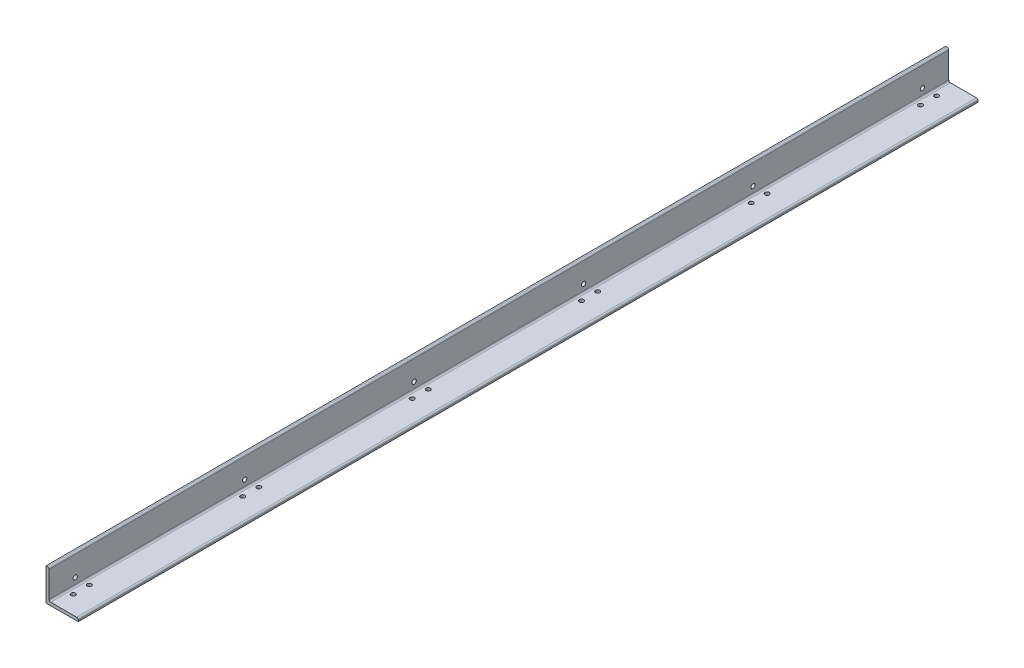
ISO-10303-21;
HEADER;
FILE_DESCRIPTION(('STEP AP214'),'2;1');
FILE_NAME('part.step','',(''),(''),'','','');
FILE_SCHEMA(('AUTOMOTIVE_DESIGN { 1 0 10303 214 1 1 1 1 }'));
ENDSEC;
DATA;
#1=APPLICATION_CONTEXT('core data for automotive mechanical design processes');
#2=APPLICATION_PROTOCOL_DEFINITION('international standard','automotive_design',2000,#1);
#3=PRODUCT_CONTEXT('',#1,'mechanical');
#4=PRODUCT('Part','Part','',(#3));
#5=PRODUCT_RELATED_PRODUCT_CATEGORY('part','',(#4));
#6=PRODUCT_DEFINITION_FORMATION('','',#4);
#7=PRODUCT_DEFINITION_CONTEXT('part definition',#1,'design');
#8=PRODUCT_DEFINITION('design','',#6,#7);
#9=PRODUCT_DEFINITION_SHAPE('','',#8);
#10=(LENGTH_UNIT() NAMED_UNIT(*) SI_UNIT(.MILLI.,.METRE.));
#11=(NAMED_UNIT(*) PLANE_ANGLE_UNIT() SI_UNIT($,.RADIAN.));
#12=(NAMED_UNIT(*) SI_UNIT($,.STERADIAN.) SOLID_ANGLE_UNIT());
#13=UNCERTAINTY_MEASURE_WITH_UNIT(LENGTH_MEASURE(1.E-05),#10,'distance_accuracy_value','');
#14=(GEOMETRIC_REPRESENTATION_CONTEXT(3) GLOBAL_UNCERTAINTY_ASSIGNED_CONTEXT((#13)) GLOBAL_UNIT_ASSIGNED_CONTEXT((#10,
#11,#12)) REPRESENTATION_CONTEXT('',''));
#15=CARTESIAN_POINT('',(0.,0.,0.));
#16=DIRECTION('',(0.,0.,1.));
#17=DIRECTION('',(1.,0.,0.));
#18=AXIS2_PLACEMENT_3D('',#15,#16,#17);
#19=CARTESIAN_POINT('',(50.8,0.,708.025));
#20=DIRECTION('',(0.,1.,0.));
#21=DIRECTION('',(-1.,0.,0.));
#22=AXIS2_PLACEMENT_3D('',#19,#20,#21);
#23=PLANE('',#22);
#24=CARTESIAN_POINT('',(14.2875,0.,387.35));
#25=DIRECTION('',(0.,1.,0.));
#26=DIRECTION('',(-1.,0.,0.));
#27=AXIS2_PLACEMENT_3D('',#24,#25,#26);
#28=CIRCLE('',#27,3.37819999999999);
#29=CARTESIAN_POINT('',(10.9093,0.,387.35));
#30=VERTEX_POINT('',#29);
#31=EDGE_CURVE('E415',#30,#30,#28,.T.);
#32=ORIENTED_EDGE('',*,*,#31,.T.);
#33=EDGE_LOOP('',(#32));
#34=FACE_BOUND('',#33,.T.);
#35=CARTESIAN_POINT('',(14.2875,0.,412.75));
#36=DIRECTION('',(0.,1.,0.));
#37=DIRECTION('',(-1.,0.,0.));
#38=AXIS2_PLACEMENT_3D('',#35,#36,#37);
#39=CIRCLE('',#38,3.37819999999999);
#40=CARTESIAN_POINT('',(10.9093,0.,412.75));
#41=VERTEX_POINT('',#40);
#42=EDGE_CURVE('E409',#41,#41,#39,.T.);
#43=ORIENTED_EDGE('',*,*,#42,.T.);
#44=EDGE_LOOP('',(#43));
#45=FACE_BOUND('',#44,.T.);
#46=CARTESIAN_POINT('',(14.2875,0.,679.45));
#47=DIRECTION('',(0.,1.,0.));
#48=DIRECTION('',(-1.,0.,0.));
#49=AXIS2_PLACEMENT_3D('',#46,#47,#48);
#50=CIRCLE('',#49,3.37819999999999);
#51=CARTESIAN_POINT('',(10.9093,0.,679.45));
#52=VERTEX_POINT('',#51);
#53=EDGE_CURVE('E392',#52,#52,#50,.T.);
#54=ORIENTED_EDGE('',*,*,#53,.T.);
#55=EDGE_LOOP('',(#54));
#56=FACE_BOUND('',#55,.T.);
#57=CARTESIAN_POINT('',(14.2875,0.,654.05));
#58=DIRECTION('',(0.,1.,0.));
#59=DIRECTION('',(-1.,0.,0.));
#60=AXIS2_PLACEMENT_3D('',#57,#58,#59);
#61=CIRCLE('',#60,3.37819999999999);
#62=CARTESIAN_POINT('',(10.9093,0.,654.05));
#63=VERTEX_POINT('',#62);
#64=EDGE_CURVE('E385',#63,#63,#61,.T.);
#65=ORIENTED_EDGE('',*,*,#64,.T.);
#66=EDGE_LOOP('',(#65));
#67=FACE_BOUND('',#66,.T.);
#68=DIRECTION('',(1.,0.,0.));
#69=VECTOR('',#68,1.);
#70=CARTESIAN_POINT('',(50.8,0.,-708.025));
#71=LINE('',#70,#69);
#72=CARTESIAN_POINT('',(0.,0.,-708.025));
#73=VERTEX_POINT('',#72);
#74=CARTESIAN_POINT('',(50.8,0.,-708.025));
#75=VERTEX_POINT('',#74);
#76=EDGE_CURVE('E134',#73,#75,#71,.T.);
#77=ORIENTED_EDGE('',*,*,#76,.T.);
#78=DIRECTION('',(0.,0.,-1.));
#79=VECTOR('',#78,1.);
#80=CARTESIAN_POINT('',(50.8,0.,708.025));
#81=LINE('',#80,#79);
#82=CARTESIAN_POINT('',(50.8,0.,708.025));
#83=VERTEX_POINT('',#82);
#84=EDGE_CURVE('E115',#83,#75,#81,.T.);
#85=ORIENTED_EDGE('',*,*,#84,.F.);
#86=DIRECTION('',(1.,0.,0.));
#87=VECTOR('',#86,1.);
#88=CARTESIAN_POINT('',(50.8,0.,708.025));
#89=LINE('',#88,#87);
#90=CARTESIAN_POINT('',(0.,0.,708.025));
#91=VERTEX_POINT('',#90);
#92=EDGE_CURVE('E121',#91,#83,#89,.T.);
#93=ORIENTED_EDGE('',*,*,#92,.F.);
#94=DIRECTION('',(0.,0.,-1.));
#95=VECTOR('',#94,1.);
#96=CARTESIAN_POINT('',(0.,0.,708.025));
#97=LINE('',#96,#95);
#98=EDGE_CURVE('E141',#91,#73,#97,.T.);
#99=ORIENTED_EDGE('',*,*,#98,.T.);
#100=EDGE_LOOP('',(#77,#85,#93,#99));
#101=FACE_BOUND('',#100,.T.);
#102=CARTESIAN_POINT('',(14.2875,0.,146.05));
#103=DIRECTION('',(0.,1.,0.));
#104=DIRECTION('',(-1.,0.,0.));
#105=AXIS2_PLACEMENT_3D('',#102,#103,#104);
#106=CIRCLE('',#105,3.37819999999999);
#107=CARTESIAN_POINT('',(10.9093,0.,146.05));
#108=VERTEX_POINT('',#107);
#109=EDGE_CURVE('E166',#108,#108,#106,.T.);
#110=ORIENTED_EDGE('',*,*,#109,.T.);
#111=EDGE_LOOP('',(#110));
#112=FACE_BOUND('',#111,.T.);
#113=CARTESIAN_POINT('',(14.2875,0.,-120.65));
#114=DIRECTION('',(0.,1.,0.));
#115=DIRECTION('',(-1.,0.,0.));
#116=AXIS2_PLACEMENT_3D('',#113,#114,#115);
#117=CIRCLE('',#116,3.37819999999999);
#118=CARTESIAN_POINT('',(10.9093,0.,-120.65));
#119=VERTEX_POINT('',#118);
#120=EDGE_CURVE('E172',#119,#119,#117,.T.);
#121=ORIENTED_EDGE('',*,*,#120,.T.);
#122=EDGE_LOOP('',(#121));
#123=FACE_BOUND('',#122,.T.);
#124=CARTESIAN_POINT('',(14.2875,0.,-387.35));
#125=DIRECTION('',(0.,1.,0.));
#126=DIRECTION('',(-1.,0.,0.));
#127=AXIS2_PLACEMENT_3D('',#124,#125,#126);
#128=CIRCLE('',#127,3.37819999999999);
#129=CARTESIAN_POINT('',(10.9093,0.,-387.35));
#130=VERTEX_POINT('',#129);
#131=EDGE_CURVE('E178',#130,#130,#128,.T.);
#132=ORIENTED_EDGE('',*,*,#131,.T.);
#133=EDGE_LOOP('',(#132));
#134=FACE_BOUND('',#133,.T.);
#135=CARTESIAN_POINT('',(14.2875,0.,-654.05));
#136=DIRECTION('',(0.,1.,0.));
#137=DIRECTION('',(-1.,0.,0.));
#138=AXIS2_PLACEMENT_3D('',#135,#136,#137);
#139=CIRCLE('',#138,3.37819999999999);
#140=CARTESIAN_POINT('',(10.9093,0.,-654.05));
#141=VERTEX_POINT('',#140);
#142=EDGE_CURVE('E184',#141,#141,#139,.T.);
#143=ORIENTED_EDGE('',*,*,#142,.T.);
#144=EDGE_LOOP('',(#143));
#145=FACE_BOUND('',#144,.T.);
#146=CARTESIAN_POINT('',(14.2875,0.,120.65));
#147=DIRECTION('',(0.,1.,0.));
#148=DIRECTION('',(-1.,0.,0.));
#149=AXIS2_PLACEMENT_3D('',#146,#147,#148);
#150=CIRCLE('',#149,3.37819999999999);
#151=CARTESIAN_POINT('',(10.9093,0.,120.65));
#152=VERTEX_POINT('',#151);
#153=EDGE_CURVE('E190',#152,#152,#150,.T.);
#154=ORIENTED_EDGE('',*,*,#153,.T.);
#155=EDGE_LOOP('',(#154));
#156=FACE_BOUND('',#155,.T.);
#157=CARTESIAN_POINT('',(14.2875,0.,-146.05));
#158=DIRECTION('',(0.,1.,0.));
#159=DIRECTION('',(-1.,0.,0.));
#160=AXIS2_PLACEMENT_3D('',#157,#158,#159);
#161=CIRCLE('',#160,3.37819999999999);
#162=CARTESIAN_POINT('',(10.9093,0.,-146.05));
#163=VERTEX_POINT('',#162);
#164=EDGE_CURVE('E196',#163,#163,#161,.T.);
#165=ORIENTED_EDGE('',*,*,#164,.T.);
#166=EDGE_LOOP('',(#165));
#167=FACE_BOUND('',#166,.T.);
#168=CARTESIAN_POINT('',(14.2875,0.,-412.75));
#169=DIRECTION('',(0.,1.,0.));
#170=DIRECTION('',(-1.,0.,0.));
#171=AXIS2_PLACEMENT_3D('',#168,#169,#170);
#172=CIRCLE('',#171,3.37819999999999);
#173=CARTESIAN_POINT('',(10.9093,0.,-412.75));
#174=VERTEX_POINT('',#173);
#175=EDGE_CURVE('E202',#174,#174,#172,.T.);
#176=ORIENTED_EDGE('',*,*,#175,.T.);
#177=EDGE_LOOP('',(#176));
#178=FACE_BOUND('',#177,.T.);
#179=CARTESIAN_POINT('',(14.2875,0.,-679.45));
#180=DIRECTION('',(0.,1.,0.));
#181=DIRECTION('',(-1.,0.,0.));
#182=AXIS2_PLACEMENT_3D('',#179,#180,#181);
#183=CIRCLE('',#182,3.37819999999999);
#184=CARTESIAN_POINT('',(10.9093,0.,-679.45));
#185=VERTEX_POINT('',#184);
#186=EDGE_CURVE('E208',#185,#185,#183,.T.);
#187=ORIENTED_EDGE('',*,*,#186,.T.);
#188=EDGE_LOOP('',(#187));
#189=FACE_BOUND('',#188,.T.);
#190=ADVANCED_FACE('F37',(#34,#45,#56,#67,#101,#112,#123,#134,#145,#156,#167,#178,#189),#23,.F.);
#191=CARTESIAN_POINT('',(50.8,4.7625,708.025));
#192=DIRECTION('',(-1.,0.,0.));
#193=DIRECTION('',(0.,0.,1.));
#194=AXIS2_PLACEMENT_3D('',#191,#192,#193);
#195=PLANE('',#194);
#196=DIRECTION('',(0.,1.,0.));
#197=VECTOR('',#196,1.);
#198=CARTESIAN_POINT('',(50.8,4.7625,-708.025));
#199=LINE('',#198,#197);
#200=CARTESIAN_POINT('',(50.8,2.22250000000001,-708.025));
#201=VERTEX_POINT('',#200);
#202=EDGE_CURVE('E375',#75,#201,#199,.T.);
#203=ORIENTED_EDGE('',*,*,#202,.T.);
#204=DIRECTION('',(0.,0.,-1.));
#205=VECTOR('',#204,1.);
#206=CARTESIAN_POINT('',(50.8,2.2225,708.025));
#207=LINE('',#206,#205);
#208=CARTESIAN_POINT('',(50.8,2.22250000000001,708.025));
#209=VERTEX_POINT('',#208);
#210=EDGE_CURVE('E118',#201,#209,#207,.F.);
#211=ORIENTED_EDGE('',*,*,#210,.T.);
#212=DIRECTION('',(0.,1.,0.));
#213=VECTOR('',#212,1.);
#214=CARTESIAN_POINT('',(50.8,4.7625,708.025));
#215=LINE('',#214,#213);
#216=EDGE_CURVE('E110',#83,#209,#215,.T.);
#217=ORIENTED_EDGE('',*,*,#216,.F.);
#218=ORIENTED_EDGE('',*,*,#84,.T.);
#219=EDGE_LOOP('',(#203,#211,#217,#218));
#220=FACE_BOUND('',#219,.T.);
#221=ADVANCED_FACE('F113',(#220),#195,.F.);
#222=CARTESIAN_POINT('',(4.76250000000001,4.7625,708.025));
#223=DIRECTION('',(0.,-1.,0.));
#224=DIRECTION('',(1.,0.,0.));
#225=AXIS2_PLACEMENT_3D('',#222,#223,#224);
#226=PLANE('',#225);
#227=CARTESIAN_POINT('',(14.2875,4.7625,387.35));
#228=DIRECTION('',(0.,1.,0.));
#229=DIRECTION('',(0.,0.,1.));
#230=AXIS2_PLACEMENT_3D('',#227,#228,#229);
#231=CIRCLE('',#230,3.37819999999999);
#232=CARTESIAN_POINT('',(14.2875,4.7625,390.7282));
#233=VERTEX_POINT('',#232);
#234=EDGE_CURVE('E412',#233,#233,#231,.T.);
#235=ORIENTED_EDGE('',*,*,#234,.F.);
#236=EDGE_LOOP('',(#235));
#237=FACE_BOUND('',#236,.T.);
#238=CARTESIAN_POINT('',(14.2875,4.7625,412.75));
#239=DIRECTION('',(0.,1.,0.));
#240=DIRECTION('',(0.,0.,1.));
#241=AXIS2_PLACEMENT_3D('',#238,#239,#240);
#242=CIRCLE('',#241,3.37819999999999);
#243=CARTESIAN_POINT('',(14.2875,4.7625,416.1282));
#244=VERTEX_POINT('',#243);
#245=EDGE_CURVE('E406',#244,#244,#242,.T.);
#246=ORIENTED_EDGE('',*,*,#245,.F.);
#247=EDGE_LOOP('',(#246));
#248=FACE_BOUND('',#247,.T.);
#249=CARTESIAN_POINT('',(14.2875,4.7625,679.45));
#250=DIRECTION('',(0.,1.,0.));
#251=DIRECTION('',(0.,0.,1.));
#252=AXIS2_PLACEMENT_3D('',#249,#250,#251);
#253=CIRCLE('',#252,3.37819999999999);
#254=CARTESIAN_POINT('',(14.2875,4.7625,682.8282));
#255=VERTEX_POINT('',#254);
#256=EDGE_CURVE('E403',#255,#255,#253,.T.);
#257=ORIENTED_EDGE('',*,*,#256,.F.);
#258=EDGE_LOOP('',(#257));
#259=FACE_BOUND('',#258,.T.);
#260=CARTESIAN_POINT('',(14.2875,4.7625,654.05));
#261=DIRECTION('',(0.,1.,0.));
#262=DIRECTION('',(0.,0.,1.));
#263=AXIS2_PLACEMENT_3D('',#260,#261,#262);
#264=CIRCLE('',#263,3.37819999999999);
#265=CARTESIAN_POINT('',(14.2875,4.7625,657.4282));
#266=VERTEX_POINT('',#265);
#267=EDGE_CURVE('E387',#266,#266,#264,.T.);
#268=ORIENTED_EDGE('',*,*,#267,.F.);
#269=EDGE_LOOP('',(#268));
#270=FACE_BOUND('',#269,.T.);
#271=DIRECTION('',(-1.,0.,0.));
#272=VECTOR('',#271,1.);
#273=CARTESIAN_POINT('',(4.76250000000001,4.7625,708.025));
#274=LINE('',#273,#272);
#275=CARTESIAN_POINT('',(48.26,4.7625,708.025));
#276=VERTEX_POINT('',#275);
#277=CARTESIAN_POINT('',(7.30250000000001,4.7625,708.025));
#278=VERTEX_POINT('',#277);
#279=EDGE_CURVE('E120',#276,#278,#274,.T.);
#280=ORIENTED_EDGE('',*,*,#279,.F.);
#281=DIRECTION('',(0.,0.,-1.));
#282=VECTOR('',#281,1.);
#283=CARTESIAN_POINT('',(48.26,4.7625,708.025));
#284=LINE('',#283,#282);
#285=CARTESIAN_POINT('',(48.26,4.7625,-708.025));
#286=VERTEX_POINT('',#285);
#287=EDGE_CURVE('E138',#276,#286,#284,.T.);
#288=ORIENTED_EDGE('',*,*,#287,.T.);
#289=DIRECTION('',(-1.,0.,0.));
#290=VECTOR('',#289,1.);
#291=CARTESIAN_POINT('',(4.76250000000001,4.7625,-708.025));
#292=LINE('',#291,#290);
#293=CARTESIAN_POINT('',(7.30250000000001,4.7625,-708.025));
#294=VERTEX_POINT('',#293);
#295=EDGE_CURVE('E368',#286,#294,#292,.T.);
#296=ORIENTED_EDGE('',*,*,#295,.T.);
#297=DIRECTION('',(0.,0.,-1.));
#298=VECTOR('',#297,1.);
#299=CARTESIAN_POINT('',(7.30250000000001,4.7625,708.025));
#300=LINE('',#299,#298);
#301=EDGE_CURVE('E135',#294,#278,#300,.F.);
#302=ORIENTED_EDGE('',*,*,#301,.T.);
#303=EDGE_LOOP('',(#280,#288,#296,#302));
#304=FACE_BOUND('',#303,.T.);
#305=CARTESIAN_POINT('',(14.2875,4.7625,146.05));
#306=DIRECTION('',(0.,1.,0.));
#307=DIRECTION('',(0.,0.,1.));
#308=AXIS2_PLACEMENT_3D('',#305,#306,#307);
#309=CIRCLE('',#308,3.37819999999999);
#310=CARTESIAN_POINT('',(14.2875,4.7625,149.4282));
#311=VERTEX_POINT('',#310);
#312=EDGE_CURVE('E169',#311,#311,#309,.T.);
#313=ORIENTED_EDGE('',*,*,#312,.F.);
#314=EDGE_LOOP('',(#313));
#315=FACE_BOUND('',#314,.T.);
#316=CARTESIAN_POINT('',(14.2875,4.7625,-120.65));
#317=DIRECTION('',(0.,1.,0.));
#318=DIRECTION('',(0.,0.,1.));
#319=AXIS2_PLACEMENT_3D('',#316,#317,#318);
#320=CIRCLE('',#319,3.37819999999999);
#321=CARTESIAN_POINT('',(14.2875,4.7625,-117.2718));
#322=VERTEX_POINT('',#321);
#323=EDGE_CURVE('E175',#322,#322,#320,.T.);
#324=ORIENTED_EDGE('',*,*,#323,.F.);
#325=EDGE_LOOP('',(#324));
#326=FACE_BOUND('',#325,.T.);
#327=CARTESIAN_POINT('',(14.2875,4.7625,-387.35));
#328=DIRECTION('',(0.,1.,0.));
#329=DIRECTION('',(0.,0.,1.));
#330=AXIS2_PLACEMENT_3D('',#327,#328,#329);
#331=CIRCLE('',#330,3.37819999999999);
#332=CARTESIAN_POINT('',(14.2875,4.7625,-383.9718));
#333=VERTEX_POINT('',#332);
#334=EDGE_CURVE('E181',#333,#333,#331,.T.);
#335=ORIENTED_EDGE('',*,*,#334,.F.);
#336=EDGE_LOOP('',(#335));
#337=FACE_BOUND('',#336,.T.);
#338=CARTESIAN_POINT('',(14.2875,4.7625,-654.05));
#339=DIRECTION('',(0.,1.,0.));
#340=DIRECTION('',(0.,0.,1.));
#341=AXIS2_PLACEMENT_3D('',#338,#339,#340);
#342=CIRCLE('',#341,3.37819999999999);
#343=CARTESIAN_POINT('',(14.2875,4.7625,-650.6718));
#344=VERTEX_POINT('',#343);
#345=EDGE_CURVE('E187',#344,#344,#342,.T.);
#346=ORIENTED_EDGE('',*,*,#345,.F.);
#347=EDGE_LOOP('',(#346));
#348=FACE_BOUND('',#347,.T.);
#349=CARTESIAN_POINT('',(14.2875,4.7625,120.65));
#350=DIRECTION('',(0.,1.,0.));
#351=DIRECTION('',(0.,0.,1.));
#352=AXIS2_PLACEMENT_3D('',#349,#350,#351);
#353=CIRCLE('',#352,3.37819999999999);
#354=CARTESIAN_POINT('',(14.2875,4.7625,124.0282));
#355=VERTEX_POINT('',#354);
#356=EDGE_CURVE('E193',#355,#355,#353,.T.);
#357=ORIENTED_EDGE('',*,*,#356,.F.);
#358=EDGE_LOOP('',(#357));
#359=FACE_BOUND('',#358,.T.);
#360=CARTESIAN_POINT('',(14.2875,4.7625,-146.05));
#361=DIRECTION('',(0.,1.,0.));
#362=DIRECTION('',(0.,0.,1.));
#363=AXIS2_PLACEMENT_3D('',#360,#361,#362);
#364=CIRCLE('',#363,3.37819999999999);
#365=CARTESIAN_POINT('',(14.2875,4.7625,-142.6718));
#366=VERTEX_POINT('',#365);
#367=EDGE_CURVE('E199',#366,#366,#364,.T.);
#368=ORIENTED_EDGE('',*,*,#367,.F.);
#369=EDGE_LOOP('',(#368));
#370=FACE_BOUND('',#369,.T.);
#371=CARTESIAN_POINT('',(14.2875,4.7625,-412.75));
#372=DIRECTION('',(0.,1.,0.));
#373=DIRECTION('',(0.,0.,1.));
#374=AXIS2_PLACEMENT_3D('',#371,#372,#373);
#375=CIRCLE('',#374,3.37819999999999);
#376=CARTESIAN_POINT('',(14.2875,4.7625,-409.3718));
#377=VERTEX_POINT('',#376);
#378=EDGE_CURVE('E205',#377,#377,#375,.T.);
#379=ORIENTED_EDGE('',*,*,#378,.F.);
#380=EDGE_LOOP('',(#379));
#381=FACE_BOUND('',#380,.T.);
#382=CARTESIAN_POINT('',(14.2875,4.7625,-679.45));
#383=DIRECTION('',(0.,1.,0.));
#384=DIRECTION('',(0.,0.,1.));
#385=AXIS2_PLACEMENT_3D('',#382,#383,#384);
#386=CIRCLE('',#385,3.37819999999999);
#387=CARTESIAN_POINT('',(14.2875,4.7625,-676.0718));
#388=VERTEX_POINT('',#387);
#389=EDGE_CURVE('E211',#388,#388,#386,.T.);
#390=ORIENTED_EDGE('',*,*,#389,.F.);
#391=EDGE_LOOP('',(#390));
#392=FACE_BOUND('',#391,.T.);
#393=ADVANCED_FACE('F263',(#237,#248,#259,#270,#304,#315,#326,#337,#348,#359,#370,#381,#392),
#226,.F.);
#394=CARTESIAN_POINT('',(4.7625,50.8,708.025));
#395=DIRECTION('',(-1.,0.,0.));
#396=DIRECTION('',(0.,-1.,0.));
#397=AXIS2_PLACEMENT_3D('',#394,#395,#396);
#398=PLANE('',#397);
#399=CARTESIAN_POINT('',(4.7625,16.66875,-400.05));
#400=DIRECTION('',(-1.,0.,0.));
#401=DIRECTION('',(0.,-1.,0.));
#402=AXIS2_PLACEMENT_3D('',#399,#400,#401);
#403=CIRCLE('',#402,3.37819999999999);
#404=CARTESIAN_POINT('',(4.76250000000001,13.29055,-400.05));
#405=VERTEX_POINT('',#404);
#406=EDGE_CURVE('E344',#405,#405,#403,.T.);
#407=ORIENTED_EDGE('',*,*,#406,.T.);
#408=EDGE_LOOP('',(#407));
#409=FACE_BOUND('',#408,.T.);
#410=CARTESIAN_POINT('',(4.7625,16.66875,-666.75));
#411=DIRECTION('',(-1.,0.,0.));
#412=DIRECTION('',(0.,-1.,0.));
#413=AXIS2_PLACEMENT_3D('',#410,#411,#412);
#414=CIRCLE('',#413,3.37819999999999);
#415=CARTESIAN_POINT('',(4.76250000000001,13.29055,-666.75));
#416=VERTEX_POINT('',#415);
#417=EDGE_CURVE('E347',#416,#416,#414,.T.);
#418=ORIENTED_EDGE('',*,*,#417,.T.);
#419=EDGE_LOOP('',(#418));
#420=FACE_BOUND('',#419,.T.);
#421=DIRECTION('',(0.,1.,0.));
#422=VECTOR('',#421,1.);
#423=CARTESIAN_POINT('',(4.7625,50.8,708.025));
#424=LINE('',#423,#422);
#425=CARTESIAN_POINT('',(4.76250000000001,7.30250000000001,708.025));
#426=VERTEX_POINT('',#425);
#427=CARTESIAN_POINT('',(4.7625,48.26,708.025));
#428=VERTEX_POINT('',#427);
#429=EDGE_CURVE('E349',#426,#428,#424,.T.);
#430=ORIENTED_EDGE('',*,*,#429,.F.);
#431=DIRECTION('',(0.,0.,-1.));
#432=VECTOR('',#431,1.);
#433=CARTESIAN_POINT('',(4.76250000000001,7.30250000000001,-708.025));
#434=LINE('',#433,#432);
#435=CARTESIAN_POINT('',(4.76250000000001,7.30250000000001,-708.025));
#436=VERTEX_POINT('',#435);
#437=EDGE_CURVE('E156',#426,#436,#434,.T.);
#438=ORIENTED_EDGE('',*,*,#437,.T.);
#439=DIRECTION('',(0.,1.,0.));
#440=VECTOR('',#439,1.);
#441=CARTESIAN_POINT('',(4.7625,50.8,-708.025));
#442=LINE('',#441,#440);
#443=CARTESIAN_POINT('',(4.7625,48.26,-708.025));
#444=VERTEX_POINT('',#443);
#445=EDGE_CURVE('E369',#436,#444,#442,.T.);
#446=ORIENTED_EDGE('',*,*,#445,.T.);
#447=DIRECTION('',(0.,0.,-1.));
#448=VECTOR('',#447,1.);
#449=CARTESIAN_POINT('',(4.7625,48.26,708.025));
#450=LINE('',#449,#448);
#451=EDGE_CURVE('E60',#444,#428,#450,.F.);
#452=ORIENTED_EDGE('',*,*,#451,.T.);
#453=EDGE_LOOP('',(#430,#438,#446,#452));
#454=FACE_BOUND('',#453,.T.);
#455=CARTESIAN_POINT('',(4.7625,16.66875,-133.35));
#456=DIRECTION('',(-1.,0.,0.));
#457=DIRECTION('',(0.,-1.,0.));
#458=AXIS2_PLACEMENT_3D('',#455,#456,#457);
#459=CIRCLE('',#458,3.37819999999999);
#460=CARTESIAN_POINT('',(4.76250000000001,13.29055,-133.35));
#461=VERTEX_POINT('',#460);
#462=EDGE_CURVE('E214',#461,#461,#459,.T.);
#463=ORIENTED_EDGE('',*,*,#462,.T.);
#464=EDGE_LOOP('',(#463));
#465=FACE_BOUND('',#464,.T.);
#466=CARTESIAN_POINT('',(4.7625,16.66875,133.35));
#467=DIRECTION('',(-1.,0.,0.));
#468=DIRECTION('',(0.,-1.,0.));
#469=AXIS2_PLACEMENT_3D('',#466,#467,#468);
#470=CIRCLE('',#469,3.37819999999999);
#471=CARTESIAN_POINT('',(4.76250000000001,13.29055,133.35));
#472=VERTEX_POINT('',#471);
#473=EDGE_CURVE('E220',#472,#472,#470,.T.);
#474=ORIENTED_EDGE('',*,*,#473,.T.);
#475=EDGE_LOOP('',(#474));
#476=FACE_BOUND('',#475,.T.);
#477=CARTESIAN_POINT('',(4.7625,16.66875,400.05));
#478=DIRECTION('',(-1.,0.,0.));
#479=DIRECTION('',(0.,-1.,0.));
#480=AXIS2_PLACEMENT_3D('',#477,#478,#479);
#481=CIRCLE('',#480,3.37819999999999);
#482=CARTESIAN_POINT('',(4.76250000000001,13.29055,400.05));
#483=VERTEX_POINT('',#482);
#484=EDGE_CURVE('E226',#483,#483,#481,.T.);
#485=ORIENTED_EDGE('',*,*,#484,.T.);
#486=EDGE_LOOP('',(#485));
#487=FACE_BOUND('',#486,.T.);
#488=CARTESIAN_POINT('',(4.7625,16.66875,666.75));
#489=DIRECTION('',(-1.,0.,0.));
#490=DIRECTION('',(0.,-1.,0.));
#491=AXIS2_PLACEMENT_3D('',#488,#489,#490);
#492=CIRCLE('',#491,3.37819999999999);
#493=CARTESIAN_POINT('',(4.76250000000001,13.29055,666.75));
#494=VERTEX_POINT('',#493);
#495=EDGE_CURVE('E45',#494,#494,#492,.T.);
#496=ORIENTED_EDGE('',*,*,#495,.T.);
#497=EDGE_LOOP('',(#496));
#498=FACE_BOUND('',#497,.T.);
#499=ADVANCED_FACE('F234',(#409,#420,#454,#465,#476,#487,#498),#398,.F.);
#500=CARTESIAN_POINT('',(0.,50.8,708.025));
#501=DIRECTION('',(0.,-1.,0.));
#502=DIRECTION('',(0.,0.,-1.));
#503=AXIS2_PLACEMENT_3D('',#500,#501,#502);
#504=PLANE('',#503);
#505=DIRECTION('',(-1.,0.,0.));
#506=VECTOR('',#505,1.);
#507=CARTESIAN_POINT('',(0.,50.8,708.025));
#508=LINE('',#507,#506);
#509=CARTESIAN_POINT('',(2.2225,50.8,708.025));
#510=VERTEX_POINT('',#509);
#511=CARTESIAN_POINT('',(0.,50.8,708.025));
#512=VERTEX_POINT('',#511);
#513=EDGE_CURVE('E361',#510,#512,#508,.T.);
#514=ORIENTED_EDGE('',*,*,#513,.F.);
#515=DIRECTION('',(0.,0.,-1.));
#516=VECTOR('',#515,1.);
#517=CARTESIAN_POINT('',(2.2225,50.8,708.025));
#518=LINE('',#517,#516);
#519=CARTESIAN_POINT('',(2.2225,50.8,-708.025));
#520=VERTEX_POINT('',#519);
#521=EDGE_CURVE('E159',#510,#520,#518,.T.);
#522=ORIENTED_EDGE('',*,*,#521,.T.);
#523=DIRECTION('',(-1.,0.,0.));
#524=VECTOR('',#523,1.);
#525=CARTESIAN_POINT('',(0.,50.8,-708.025));
#526=LINE('',#525,#524);
#527=CARTESIAN_POINT('',(0.,50.8,-708.025));
#528=VERTEX_POINT('',#527);
#529=EDGE_CURVE('E377',#520,#528,#526,.T.);
#530=ORIENTED_EDGE('',*,*,#529,.T.);
#531=DIRECTION('',(0.,0.,-1.));
#532=VECTOR('',#531,1.);
#533=CARTESIAN_POINT('',(0.,50.8,708.025));
#534=LINE('',#533,#532);
#535=EDGE_CURVE('E136',#512,#528,#534,.T.);
#536=ORIENTED_EDGE('',*,*,#535,.F.);
#537=EDGE_LOOP('',(#514,#522,#530,#536));
#538=FACE_BOUND('',#537,.T.);
#539=ADVANCED_FACE('F243',(#538),#504,.F.);
#540=CARTESIAN_POINT('',(0.,0.,708.025));
#541=DIRECTION('',(1.,0.,0.));
#542=DIRECTION('',(0.,0.,-1.));
#543=AXIS2_PLACEMENT_3D('',#540,#541,#542);
#544=PLANE('',#543);
#545=CARTESIAN_POINT('',(0.,16.66875,-400.05));
#546=DIRECTION('',(-1.,0.,0.));
#547=DIRECTION('',(0.,0.,1.));
#548=AXIS2_PLACEMENT_3D('',#545,#546,#547);
#549=CIRCLE('',#548,3.37819999999999);
#550=CARTESIAN_POINT('',(0.,16.66875,-396.6718));
#551=VERTEX_POINT('',#550);
#552=EDGE_CURVE('E421',#551,#551,#549,.T.);
#553=ORIENTED_EDGE('',*,*,#552,.F.);
#554=EDGE_LOOP('',(#553));
#555=FACE_BOUND('',#554,.T.);
#556=CARTESIAN_POINT('',(0.,16.66875,-666.75));
#557=DIRECTION('',(-1.,0.,0.));
#558=DIRECTION('',(0.,0.,1.));
#559=AXIS2_PLACEMENT_3D('',#556,#557,#558);
#560=CIRCLE('',#559,3.37819999999999);
#561=CARTESIAN_POINT('',(0.,16.66875,-663.3718));
#562=VERTEX_POINT('',#561);
#563=EDGE_CURVE('E418',#562,#562,#560,.T.);
#564=ORIENTED_EDGE('',*,*,#563,.F.);
#565=EDGE_LOOP('',(#564));
#566=FACE_BOUND('',#565,.T.);
#567=DIRECTION('',(0.,-1.,0.));
#568=VECTOR('',#567,1.);
#569=CARTESIAN_POINT('',(0.,0.,-708.025));
#570=LINE('',#569,#568);
#571=EDGE_CURVE('E130',#528,#73,#570,.T.);
#572=ORIENTED_EDGE('',*,*,#571,.T.);
#573=ORIENTED_EDGE('',*,*,#98,.F.);
#574=DIRECTION('',(0.,-1.,0.));
#575=VECTOR('',#574,1.);
#576=CARTESIAN_POINT('',(0.,0.,708.025));
#577=LINE('',#576,#575);
#578=EDGE_CURVE('E126',#512,#91,#577,.T.);
#579=ORIENTED_EDGE('',*,*,#578,.F.);
#580=ORIENTED_EDGE('',*,*,#535,.T.);
#581=EDGE_LOOP('',(#572,#573,#579,#580));
#582=FACE_BOUND('',#581,.T.);
#583=CARTESIAN_POINT('',(0.,16.66875,-133.35));
#584=DIRECTION('',(-1.,0.,0.));
#585=DIRECTION('',(0.,0.,1.));
#586=AXIS2_PLACEMENT_3D('',#583,#584,#585);
#587=CIRCLE('',#586,3.37819999999999);
#588=CARTESIAN_POINT('',(0.,16.66875,-129.9718));
#589=VERTEX_POINT('',#588);
#590=EDGE_CURVE('E217',#589,#589,#587,.T.);
#591=ORIENTED_EDGE('',*,*,#590,.F.);
#592=EDGE_LOOP('',(#591));
#593=FACE_BOUND('',#592,.T.);
#594=CARTESIAN_POINT('',(0.,16.66875,133.35));
#595=DIRECTION('',(-1.,0.,0.));
#596=DIRECTION('',(0.,0.,1.));
#597=AXIS2_PLACEMENT_3D('',#594,#595,#596);
#598=CIRCLE('',#597,3.37819999999999);
#599=CARTESIAN_POINT('',(0.,16.66875,136.7282));
#600=VERTEX_POINT('',#599);
#601=EDGE_CURVE('E223',#600,#600,#598,.T.);
#602=ORIENTED_EDGE('',*,*,#601,.F.);
#603=EDGE_LOOP('',(#602));
#604=FACE_BOUND('',#603,.T.);
#605=CARTESIAN_POINT('',(0.,16.66875,400.05));
#606=DIRECTION('',(-1.,0.,0.));
#607=DIRECTION('',(0.,0.,1.));
#608=AXIS2_PLACEMENT_3D('',#605,#606,#607);
#609=CIRCLE('',#608,3.37819999999999);
#610=CARTESIAN_POINT('',(0.,16.66875,403.4282));
#611=VERTEX_POINT('',#610);
#612=EDGE_CURVE('E229',#611,#611,#609,.T.);
#613=ORIENTED_EDGE('',*,*,#612,.F.);
#614=EDGE_LOOP('',(#613));
#615=FACE_BOUND('',#614,.T.);
#616=CARTESIAN_POINT('',(0.,16.66875,666.75));
#617=DIRECTION('',(-1.,0.,0.));
#618=DIRECTION('',(0.,0.,1.));
#619=AXIS2_PLACEMENT_3D('',#616,#617,#618);
#620=CIRCLE('',#619,3.37819999999999);
#621=CARTESIAN_POINT('',(0.,16.66875,670.1282));
#622=VERTEX_POINT('',#621);
#623=EDGE_CURVE('E11',#622,#622,#620,.T.);
#624=ORIENTED_EDGE('',*,*,#623,.F.);
#625=EDGE_LOOP('',(#624));
#626=FACE_BOUND('',#625,.T.);
#627=ADVANCED_FACE('F241',(#555,#566,#582,#593,#604,#615,#626),#544,.F.);
#628=CARTESIAN_POINT('',(0.,0.,708.025));
#629=DIRECTION('',(0.,0.,-1.));
#630=DIRECTION('',(-1.,0.,0.));
#631=AXIS2_PLACEMENT_3D('',#628,#629,#630);
#632=PLANE('',#631);
#633=ORIENTED_EDGE('',*,*,#216,.T.);
#634=CARTESIAN_POINT('',(48.26,2.2225,708.025));
#635=DIRECTION('',(0.,0.,-1.));
#636=DIRECTION('',(-1.,0.,0.));
#637=AXIS2_PLACEMENT_3D('',#634,#635,#636);
#638=CIRCLE('',#637,2.54);
#639=EDGE_CURVE('E153',#209,#276,#638,.F.);
#640=ORIENTED_EDGE('',*,*,#639,.T.);
#641=ORIENTED_EDGE('',*,*,#279,.T.);
#642=CARTESIAN_POINT('',(7.30250000000001,7.30250000000001,708.025));
#643=DIRECTION('',(0.,0.,-1.));
#644=DIRECTION('',(-1.,0.,0.));
#645=AXIS2_PLACEMENT_3D('',#642,#643,#644);
#646=CIRCLE('',#645,2.54);
#647=EDGE_CURVE('E164',#278,#426,#646,.T.);
#648=ORIENTED_EDGE('',*,*,#647,.T.);
#649=ORIENTED_EDGE('',*,*,#429,.T.);
#650=CARTESIAN_POINT('',(2.2225,48.26,708.025));
#651=DIRECTION('',(0.,0.,-1.));
#652=DIRECTION('',(-1.,0.,0.));
#653=AXIS2_PLACEMENT_3D('',#650,#651,#652);
#654=CIRCLE('',#653,2.54);
#655=EDGE_CURVE('E52',#428,#510,#654,.F.);
#656=ORIENTED_EDGE('',*,*,#655,.T.);
#657=ORIENTED_EDGE('',*,*,#513,.T.);
#658=ORIENTED_EDGE('',*,*,#578,.T.);
#659=ORIENTED_EDGE('',*,*,#92,.T.);
#660=EDGE_LOOP('',(#633,#640,#641,#648,#649,#656,#657,#658,#659));
#661=FACE_BOUND('',#660,.T.);
#662=ADVANCED_FACE('F124',(#661),#632,.F.);
#663=CARTESIAN_POINT('',(0.,0.,-708.025));
#664=DIRECTION('',(0.,0.,-1.));
#665=DIRECTION('',(-1.,0.,0.));
#666=AXIS2_PLACEMENT_3D('',#663,#664,#665);
#667=PLANE('',#666);
#668=ORIENTED_EDGE('',*,*,#295,.F.);
#669=CARTESIAN_POINT('',(48.26,2.2225,-708.025));
#670=DIRECTION('',(0.,0.,-1.));
#671=DIRECTION('',(-1.,0.,0.));
#672=AXIS2_PLACEMENT_3D('',#669,#670,#671);
#673=CIRCLE('',#672,2.54);
#674=EDGE_CURVE('E149',#286,#201,#673,.T.);
#675=ORIENTED_EDGE('',*,*,#674,.T.);
#676=ORIENTED_EDGE('',*,*,#202,.F.);
#677=ORIENTED_EDGE('',*,*,#76,.F.);
#678=ORIENTED_EDGE('',*,*,#571,.F.);
#679=ORIENTED_EDGE('',*,*,#529,.F.);
#680=CARTESIAN_POINT('',(2.2225,48.26,-708.025));
#681=DIRECTION('',(0.,0.,-1.));
#682=DIRECTION('',(-1.,0.,0.));
#683=AXIS2_PLACEMENT_3D('',#680,#681,#682);
#684=CIRCLE('',#683,2.54);
#685=EDGE_CURVE('E147',#520,#444,#684,.T.);
#686=ORIENTED_EDGE('',*,*,#685,.T.);
#687=ORIENTED_EDGE('',*,*,#445,.F.);
#688=CARTESIAN_POINT('',(7.30250000000001,7.30250000000001,-708.025));
#689=DIRECTION('',(0.,0.,-1.));
#690=DIRECTION('',(-1.,0.,0.));
#691=AXIS2_PLACEMENT_3D('',#688,#689,#690);
#692=CIRCLE('',#691,2.54);
#693=EDGE_CURVE('E162',#436,#294,#692,.F.);
#694=ORIENTED_EDGE('',*,*,#693,.T.);
#695=EDGE_LOOP('',(#668,#675,#676,#677,#678,#679,#686,#687,#694));
#696=FACE_BOUND('',#695,.T.);
#697=ADVANCED_FACE('F250',(#696),#667,.T.);
#698=CARTESIAN_POINT('',(48.26,2.2225,708.025));
#699=DIRECTION('',(0.,0.,-1.));
#700=DIRECTION('',(-1.,0.,0.));
#701=AXIS2_PLACEMENT_3D('',#698,#699,#700);
#702=CYLINDRICAL_SURFACE('',#701,2.54);
#703=ORIENTED_EDGE('',*,*,#639,.F.);
#704=ORIENTED_EDGE('',*,*,#210,.F.);
#705=ORIENTED_EDGE('',*,*,#674,.F.);
#706=ORIENTED_EDGE('',*,*,#287,.F.);
#707=EDGE_LOOP('',(#703,#704,#705,#706));
#708=FACE_BOUND('',#707,.T.);
#709=ADVANCED_FACE('F269',(#708),#702,.T.);
#710=CARTESIAN_POINT('',(7.30250000000001,7.30250000000001,708.025));
#711=DIRECTION('',(0.,0.,1.));
#712=DIRECTION('',(1.,0.,0.));
#713=AXIS2_PLACEMENT_3D('',#710,#711,#712);
#714=CYLINDRICAL_SURFACE('',#713,2.54);
#715=ORIENTED_EDGE('',*,*,#647,.F.);
#716=ORIENTED_EDGE('',*,*,#301,.F.);
#717=ORIENTED_EDGE('',*,*,#693,.F.);
#718=ORIENTED_EDGE('',*,*,#437,.F.);
#719=EDGE_LOOP('',(#715,#716,#717,#718));
#720=FACE_BOUND('',#719,.T.);
#721=ADVANCED_FACE('F272',(#720),#714,.F.);
#722=CARTESIAN_POINT('',(2.2225,48.26,708.025));
#723=DIRECTION('',(0.,0.,-1.));
#724=DIRECTION('',(-1.,0.,0.));
#725=AXIS2_PLACEMENT_3D('',#722,#723,#724);
#726=CYLINDRICAL_SURFACE('',#725,2.54);
#727=ORIENTED_EDGE('',*,*,#655,.F.);
#728=ORIENTED_EDGE('',*,*,#451,.F.);
#729=ORIENTED_EDGE('',*,*,#685,.F.);
#730=ORIENTED_EDGE('',*,*,#521,.F.);
#731=EDGE_LOOP('',(#727,#728,#729,#730));
#732=FACE_BOUND('',#731,.T.);
#733=ADVANCED_FACE('F276',(#732),#726,.T.);
#734=CARTESIAN_POINT('',(14.2875,4.7625,654.05));
#735=DIRECTION('',(0.,1.,0.));
#736=DIRECTION('',(0.,0.,1.));
#737=AXIS2_PLACEMENT_3D('',#734,#735,#736);
#738=CYLINDRICAL_SURFACE('',#737,3.37819999999999);
#739=ORIENTED_EDGE('',*,*,#64,.F.);
#740=EDGE_LOOP('',(#739));
#741=FACE_BOUND('',#740,.T.);
#742=ORIENTED_EDGE('',*,*,#267,.T.);
#743=EDGE_LOOP('',(#742));
#744=FACE_BOUND('',#743,.T.);
#745=ADVANCED_FACE('F280',(#741,#744),#738,.F.);
#746=CARTESIAN_POINT('',(14.2875,4.7625,679.45));
#747=DIRECTION('',(0.,1.,0.));
#748=DIRECTION('',(0.,0.,1.));
#749=AXIS2_PLACEMENT_3D('',#746,#747,#748);
#750=CYLINDRICAL_SURFACE('',#749,3.37819999999999);
#751=ORIENTED_EDGE('',*,*,#53,.F.);
#752=EDGE_LOOP('',(#751));
#753=FACE_BOUND('',#752,.T.);
#754=ORIENTED_EDGE('',*,*,#256,.T.);
#755=EDGE_LOOP('',(#754));
#756=FACE_BOUND('',#755,.T.);
#757=ADVANCED_FACE('F439',(#753,#756),#750,.F.);
#758=CARTESIAN_POINT('',(14.2875,4.7625,412.75));
#759=DIRECTION('',(0.,1.,0.));
#760=DIRECTION('',(0.,0.,1.));
#761=AXIS2_PLACEMENT_3D('',#758,#759,#760);
#762=CYLINDRICAL_SURFACE('',#761,3.37819999999999);
#763=ORIENTED_EDGE('',*,*,#42,.F.);
#764=EDGE_LOOP('',(#763));
#765=FACE_BOUND('',#764,.T.);
#766=ORIENTED_EDGE('',*,*,#245,.T.);
#767=EDGE_LOOP('',(#766));
#768=FACE_BOUND('',#767,.T.);
#769=ADVANCED_FACE('F286',(#765,#768),#762,.F.);
#770=CARTESIAN_POINT('',(14.2875,4.7625,146.05));
#771=DIRECTION('',(0.,1.,0.));
#772=DIRECTION('',(0.,0.,1.));
#773=AXIS2_PLACEMENT_3D('',#770,#771,#772);
#774=CYLINDRICAL_SURFACE('',#773,3.37819999999999);
#775=ORIENTED_EDGE('',*,*,#109,.F.);
#776=EDGE_LOOP('',(#775));
#777=FACE_BOUND('',#776,.T.);
#778=ORIENTED_EDGE('',*,*,#312,.T.);
#779=EDGE_LOOP('',(#778));
#780=FACE_BOUND('',#779,.T.);
#781=ADVANCED_FACE('F282',(#777,#780),#774,.F.);
#782=CARTESIAN_POINT('',(14.2875,4.7625,-120.65));
#783=DIRECTION('',(0.,1.,0.));
#784=DIRECTION('',(0.,0.,1.));
#785=AXIS2_PLACEMENT_3D('',#782,#783,#784);
#786=CYLINDRICAL_SURFACE('',#785,3.37819999999999);
#787=ORIENTED_EDGE('',*,*,#120,.F.);
#788=EDGE_LOOP('',(#787));
#789=FACE_BOUND('',#788,.T.);
#790=ORIENTED_EDGE('',*,*,#323,.T.);
#791=EDGE_LOOP('',(#790));
#792=FACE_BOUND('',#791,.T.);
#793=ADVANCED_FACE('F285',(#789,#792),#786,.F.);
#794=CARTESIAN_POINT('',(14.2875,4.7625,-387.35));
#795=DIRECTION('',(0.,1.,0.));
#796=DIRECTION('',(0.,0.,1.));
#797=AXIS2_PLACEMENT_3D('',#794,#795,#796);
#798=CYLINDRICAL_SURFACE('',#797,3.37819999999999);
#799=ORIENTED_EDGE('',*,*,#131,.F.);
#800=EDGE_LOOP('',(#799));
#801=FACE_BOUND('',#800,.T.);
#802=ORIENTED_EDGE('',*,*,#334,.T.);
#803=EDGE_LOOP('',(#802));
#804=FACE_BOUND('',#803,.T.);
#805=ADVANCED_FACE('F290',(#801,#804),#798,.F.);
#806=CARTESIAN_POINT('',(14.2875,4.7625,-654.05));
#807=DIRECTION('',(0.,1.,0.));
#808=DIRECTION('',(0.,0.,1.));
#809=AXIS2_PLACEMENT_3D('',#806,#807,#808);
#810=CYLINDRICAL_SURFACE('',#809,3.37819999999999);
#811=ORIENTED_EDGE('',*,*,#142,.F.);
#812=EDGE_LOOP('',(#811));
#813=FACE_BOUND('',#812,.T.);
#814=ORIENTED_EDGE('',*,*,#345,.T.);
#815=EDGE_LOOP('',(#814));
#816=FACE_BOUND('',#815,.T.);
#817=ADVANCED_FACE('F294',(#813,#816),#810,.F.);
#818=CARTESIAN_POINT('',(14.2875,4.7625,387.35));
#819=DIRECTION('',(0.,1.,0.));
#820=DIRECTION('',(0.,0.,1.));
#821=AXIS2_PLACEMENT_3D('',#818,#819,#820);
#822=CYLINDRICAL_SURFACE('',#821,3.37819999999999);
#823=ORIENTED_EDGE('',*,*,#31,.F.);
#824=EDGE_LOOP('',(#823));
#825=FACE_BOUND('',#824,.T.);
#826=ORIENTED_EDGE('',*,*,#234,.T.);
#827=EDGE_LOOP('',(#826));
#828=FACE_BOUND('',#827,.T.);
#829=ADVANCED_FACE('F298',(#825,#828),#822,.F.);
#830=CARTESIAN_POINT('',(14.2875,4.7625,120.65));
#831=DIRECTION('',(0.,1.,0.));
#832=DIRECTION('',(0.,0.,1.));
#833=AXIS2_PLACEMENT_3D('',#830,#831,#832);
#834=CYLINDRICAL_SURFACE('',#833,3.37819999999999);
#835=ORIENTED_EDGE('',*,*,#153,.F.);
#836=EDGE_LOOP('',(#835));
#837=FACE_BOUND('',#836,.T.);
#838=ORIENTED_EDGE('',*,*,#356,.T.);
#839=EDGE_LOOP('',(#838));
#840=FACE_BOUND('',#839,.T.);
#841=ADVANCED_FACE('F300',(#837,#840),#834,.F.);
#842=CARTESIAN_POINT('',(14.2875,4.7625,-146.05));
#843=DIRECTION('',(0.,1.,0.));
#844=DIRECTION('',(0.,0.,1.));
#845=AXIS2_PLACEMENT_3D('',#842,#843,#844);
#846=CYLINDRICAL_SURFACE('',#845,3.37819999999999);
#847=ORIENTED_EDGE('',*,*,#164,.F.);
#848=EDGE_LOOP('',(#847));
#849=FACE_BOUND('',#848,.T.);
#850=ORIENTED_EDGE('',*,*,#367,.T.);
#851=EDGE_LOOP('',(#850));
#852=FACE_BOUND('',#851,.T.);
#853=ADVANCED_FACE('F303',(#849,#852),#846,.F.);
#854=CARTESIAN_POINT('',(14.2875,4.7625,-412.75));
#855=DIRECTION('',(0.,1.,0.));
#856=DIRECTION('',(0.,0.,1.));
#857=AXIS2_PLACEMENT_3D('',#854,#855,#856);
#858=CYLINDRICAL_SURFACE('',#857,3.37819999999999);
#859=ORIENTED_EDGE('',*,*,#175,.F.);
#860=EDGE_LOOP('',(#859));
#861=FACE_BOUND('',#860,.T.);
#862=ORIENTED_EDGE('',*,*,#378,.T.);
#863=EDGE_LOOP('',(#862));
#864=FACE_BOUND('',#863,.T.);
#865=ADVANCED_FACE('F307',(#861,#864),#858,.F.);
#866=CARTESIAN_POINT('',(14.2875,4.7625,-679.45));
#867=DIRECTION('',(0.,1.,0.));
#868=DIRECTION('',(0.,0.,1.));
#869=AXIS2_PLACEMENT_3D('',#866,#867,#868);
#870=CYLINDRICAL_SURFACE('',#869,3.37819999999999);
#871=ORIENTED_EDGE('',*,*,#186,.F.);
#872=EDGE_LOOP('',(#871));
#873=FACE_BOUND('',#872,.T.);
#874=ORIENTED_EDGE('',*,*,#389,.T.);
#875=EDGE_LOOP('',(#874));
#876=FACE_BOUND('',#875,.T.);
#877=ADVANCED_FACE('F311',(#873,#876),#870,.F.);
#878=CARTESIAN_POINT('',(0.,16.66875,-666.75));
#879=DIRECTION('',(-1.,0.,0.));
#880=DIRECTION('',(0.,0.,1.));
#881=AXIS2_PLACEMENT_3D('',#878,#879,#880);
#882=CYLINDRICAL_SURFACE('',#881,3.37819999999999);
#883=ORIENTED_EDGE('',*,*,#417,.F.);
#884=EDGE_LOOP('',(#883));
#885=FACE_BOUND('',#884,.T.);
#886=ORIENTED_EDGE('',*,*,#563,.T.);
#887=EDGE_LOOP('',(#886));
#888=FACE_BOUND('',#887,.T.);
#889=ADVANCED_FACE('F315',(#885,#888),#882,.F.);
#890=CARTESIAN_POINT('',(0.,16.66875,-400.05));
#891=DIRECTION('',(-1.,0.,0.));
#892=DIRECTION('',(0.,0.,1.));
#893=AXIS2_PLACEMENT_3D('',#890,#891,#892);
#894=CYLINDRICAL_SURFACE('',#893,3.37819999999999);
#895=ORIENTED_EDGE('',*,*,#406,.F.);
#896=EDGE_LOOP('',(#895));
#897=FACE_BOUND('',#896,.T.);
#898=ORIENTED_EDGE('',*,*,#552,.T.);
#899=EDGE_LOOP('',(#898));
#900=FACE_BOUND('',#899,.T.);
#901=ADVANCED_FACE('F321',(#897,#900),#894,.F.);
#902=CARTESIAN_POINT('',(0.,16.66875,-133.35));
#903=DIRECTION('',(-1.,0.,0.));
#904=DIRECTION('',(0.,0.,1.));
#905=AXIS2_PLACEMENT_3D('',#902,#903,#904);
#906=CYLINDRICAL_SURFACE('',#905,3.37819999999999);
#907=ORIENTED_EDGE('',*,*,#462,.F.);
#908=EDGE_LOOP('',(#907));
#909=FACE_BOUND('',#908,.T.);
#910=ORIENTED_EDGE('',*,*,#590,.T.);
#911=EDGE_LOOP('',(#910));
#912=FACE_BOUND('',#911,.T.);
#913=ADVANCED_FACE('F317',(#909,#912),#906,.F.);
#914=CARTESIAN_POINT('',(0.,16.66875,133.35));
#915=DIRECTION('',(-1.,0.,0.));
#916=DIRECTION('',(0.,0.,1.));
#917=AXIS2_PLACEMENT_3D('',#914,#915,#916);
#918=CYLINDRICAL_SURFACE('',#917,3.37819999999999);
#919=ORIENTED_EDGE('',*,*,#473,.F.);
#920=EDGE_LOOP('',(#919));
#921=FACE_BOUND('',#920,.T.);
#922=ORIENTED_EDGE('',*,*,#601,.T.);
#923=EDGE_LOOP('',(#922));
#924=FACE_BOUND('',#923,.T.);
#925=ADVANCED_FACE('F320',(#921,#924),#918,.F.);
#926=CARTESIAN_POINT('',(0.,16.66875,400.05));
#927=DIRECTION('',(-1.,0.,0.));
#928=DIRECTION('',(0.,0.,1.));
#929=AXIS2_PLACEMENT_3D('',#926,#927,#928);
#930=CYLINDRICAL_SURFACE('',#929,3.37819999999999);
#931=ORIENTED_EDGE('',*,*,#484,.F.);
#932=EDGE_LOOP('',(#931));
#933=FACE_BOUND('',#932,.T.);
#934=ORIENTED_EDGE('',*,*,#612,.T.);
#935=EDGE_LOOP('',(#934));
#936=FACE_BOUND('',#935,.T.);
#937=ADVANCED_FACE('F238',(#933,#936),#930,.F.);
#938=CARTESIAN_POINT('',(0.,16.66875,666.75));
#939=DIRECTION('',(-1.,0.,0.));
#940=DIRECTION('',(0.,0.,1.));
#941=AXIS2_PLACEMENT_3D('',#938,#939,#940);
#942=CYLINDRICAL_SURFACE('',#941,3.37819999999999);
#943=ORIENTED_EDGE('',*,*,#495,.F.);
#944=EDGE_LOOP('',(#943));
#945=FACE_BOUND('',#944,.T.);
#946=ORIENTED_EDGE('',*,*,#623,.T.);
#947=EDGE_LOOP('',(#946));
#948=FACE_BOUND('',#947,.T.);
#949=ADVANCED_FACE('F39',(#945,#948),#942,.F.);
#950=CLOSED_SHELL('',(#190,#221,#393,#499,#539,#627,#662,#697,#709,#721,#733,#745,#757,#769,
#781,#793,#805,#817,#829,#841,#853,#865,#877,#889,#901,#913,#925,#937,#949));
#951=MANIFOLD_SOLID_BREP('B2',#950);
#952=ADVANCED_BREP_SHAPE_REPRESENTATION('',(#18,#951),#14);
#953=SHAPE_DEFINITION_REPRESENTATION(#9,#952);
ENDSEC;
END-ISO-10303-21;
